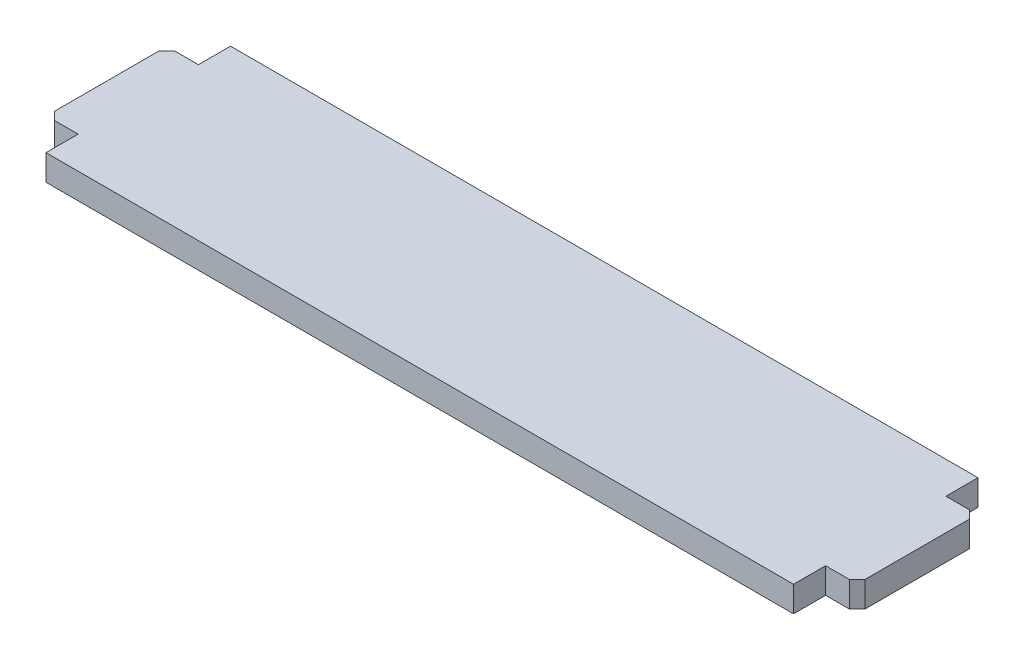
ISO-10303-21;
HEADER;
FILE_DESCRIPTION(('STEP AP214'),'2;1');
FILE_NAME('part.step','',(''),(''),'','','');
FILE_SCHEMA(('AUTOMOTIVE_DESIGN { 1 0 10303 214 1 1 1 1 }'));
ENDSEC;
DATA;
#1=APPLICATION_CONTEXT('core data for automotive mechanical design processes');
#2=APPLICATION_PROTOCOL_DEFINITION('international standard','automotive_design',2000,#1);
#3=PRODUCT_CONTEXT('',#1,'mechanical');
#4=PRODUCT('Part','Part','',(#3));
#5=PRODUCT_RELATED_PRODUCT_CATEGORY('part','',(#4));
#6=PRODUCT_DEFINITION_FORMATION('','',#4);
#7=PRODUCT_DEFINITION_CONTEXT('part definition',#1,'design');
#8=PRODUCT_DEFINITION('design','',#6,#7);
#9=PRODUCT_DEFINITION_SHAPE('','',#8);
#10=(LENGTH_UNIT() NAMED_UNIT(*) SI_UNIT(.MILLI.,.METRE.));
#11=(NAMED_UNIT(*) PLANE_ANGLE_UNIT() SI_UNIT($,.RADIAN.));
#12=(NAMED_UNIT(*) SI_UNIT($,.STERADIAN.) SOLID_ANGLE_UNIT());
#13=UNCERTAINTY_MEASURE_WITH_UNIT(LENGTH_MEASURE(1.E-05),#10,'distance_accuracy_value','');
#14=(GEOMETRIC_REPRESENTATION_CONTEXT(3) GLOBAL_UNCERTAINTY_ASSIGNED_CONTEXT((#13)) GLOBAL_UNIT_ASSIGNED_CONTEXT((#10,
#11,#12)) REPRESENTATION_CONTEXT('',''));
#15=CARTESIAN_POINT('',(0.,0.,0.));
#16=DIRECTION('',(0.,0.,1.));
#17=DIRECTION('',(1.,0.,0.));
#18=AXIS2_PLACEMENT_3D('',#15,#16,#17);
#19=CARTESIAN_POINT('',(-262.716,4.064,106.68));
#20=DIRECTION('',(-1.,0.,0.));
#21=DIRECTION('',(0.,0.,1.));
#22=AXIS2_PLACEMENT_3D('',#19,#20,#21);
#23=PLANE('',#22);
#24=DIRECTION('',(0.,0.,-1.));
#25=VECTOR('',#24,1.);
#26=CARTESIAN_POINT('',(-262.716,0.,106.68));
#27=LINE('',#26,#25);
#28=CARTESIAN_POINT('',(-262.716,0.,111.76));
#29=VERTEX_POINT('',#28);
#30=CARTESIAN_POINT('',(-262.716,0.,106.68));
#31=VERTEX_POINT('',#30);
#32=EDGE_CURVE('E171',#29,#31,#27,.T.);
#33=ORIENTED_EDGE('',*,*,#32,.T.);
#34=DIRECTION('',(0.,-1.,0.));
#35=VECTOR('',#34,1.);
#36=CARTESIAN_POINT('',(-262.716,4.064,106.68));
#37=LINE('',#36,#35);
#38=CARTESIAN_POINT('',(-262.716,4.064,106.68));
#39=VERTEX_POINT('',#38);
#40=EDGE_CURVE('E153',#39,#31,#37,.T.);
#41=ORIENTED_EDGE('',*,*,#40,.F.);
#42=DIRECTION('',(0.,0.,-1.));
#43=VECTOR('',#42,1.);
#44=CARTESIAN_POINT('',(-262.716,4.064,106.68));
#45=LINE('',#44,#43);
#46=CARTESIAN_POINT('',(-262.716,4.064,111.76));
#47=VERTEX_POINT('',#46);
#48=EDGE_CURVE('E159',#47,#39,#45,.T.);
#49=ORIENTED_EDGE('',*,*,#48,.F.);
#50=DIRECTION('',(0.,-1.,0.));
#51=VECTOR('',#50,1.);
#52=CARTESIAN_POINT('',(-262.716,4.064,111.76));
#53=LINE('',#52,#51);
#54=EDGE_CURVE('E232',#47,#29,#53,.T.);
#55=ORIENTED_EDGE('',*,*,#54,.T.);
#56=EDGE_LOOP('',(#33,#41,#49,#55));
#57=FACE_BOUND('',#56,.T.);
#58=ADVANCED_FACE('F35',(#57),#23,.F.);
#59=CARTESIAN_POINT('',(-257.716,4.064,106.68));
#60=DIRECTION('',(0.,0.,-1.));
#61=DIRECTION('',(-1.,0.,0.));
#62=AXIS2_PLACEMENT_3D('',#59,#60,#61);
#63=PLANE('',#62);
#64=DIRECTION('',(1.,0.,0.));
#65=VECTOR('',#64,1.);
#66=CARTESIAN_POINT('',(-257.716,0.,106.68));
#67=LINE('',#66,#65);
#68=CARTESIAN_POINT('',(-258.966,0.,106.68));
#69=VERTEX_POINT('',#68);
#70=EDGE_CURVE('E268',#31,#69,#67,.T.);
#71=ORIENTED_EDGE('',*,*,#70,.T.);
#72=DIRECTION('',(0.,1.,0.));
#73=VECTOR('',#72,1.);
#74=CARTESIAN_POINT('',(-258.966,4.064,106.68));
#75=LINE('',#74,#73);
#76=CARTESIAN_POINT('',(-258.966,4.064,106.68));
#77=VERTEX_POINT('',#76);
#78=EDGE_CURVE('E156',#69,#77,#75,.T.);
#79=ORIENTED_EDGE('',*,*,#78,.T.);
#80=DIRECTION('',(1.,0.,0.));
#81=VECTOR('',#80,1.);
#82=CARTESIAN_POINT('',(-257.716,4.064,106.68));
#83=LINE('',#82,#81);
#84=EDGE_CURVE('E148',#39,#77,#83,.T.);
#85=ORIENTED_EDGE('',*,*,#84,.F.);
#86=ORIENTED_EDGE('',*,*,#40,.T.);
#87=EDGE_LOOP('',(#71,#79,#85,#86));
#88=FACE_BOUND('',#87,.T.);
#89=ADVANCED_FACE('F151',(#88),#63,.F.);
#90=CARTESIAN_POINT('',(-257.716,4.064,87.63));
#91=DIRECTION('',(-1.,0.,0.));
#92=DIRECTION('',(0.,0.,1.));
#93=AXIS2_PLACEMENT_3D('',#90,#91,#92);
#94=PLANE('',#93);
#95=DIRECTION('',(0.,0.,-1.));
#96=VECTOR('',#95,1.);
#97=CARTESIAN_POINT('',(-257.716,4.064,87.63));
#98=LINE('',#97,#96);
#99=CARTESIAN_POINT('',(-257.716,4.064,105.43));
#100=VERTEX_POINT('',#99);
#101=CARTESIAN_POINT('',(-257.716,4.064,88.8800000000001));
#102=VERTEX_POINT('',#101);
#103=EDGE_CURVE('E158',#100,#102,#98,.T.);
#104=ORIENTED_EDGE('',*,*,#103,.F.);
#105=DIRECTION('',(0.,-1.,0.));
#106=VECTOR('',#105,1.);
#107=CARTESIAN_POINT('',(-257.716,4.064,105.43));
#108=LINE('',#107,#106);
#109=CARTESIAN_POINT('',(-257.716,0.,105.43));
#110=VERTEX_POINT('',#109);
#111=EDGE_CURVE('E175',#100,#110,#108,.T.);
#112=ORIENTED_EDGE('',*,*,#111,.T.);
#113=DIRECTION('',(0.,0.,-1.));
#114=VECTOR('',#113,1.);
#115=CARTESIAN_POINT('',(-257.716,0.,87.63));
#116=LINE('',#115,#114);
#117=CARTESIAN_POINT('',(-257.716,0.,88.8800000000001));
#118=VERTEX_POINT('',#117);
#119=EDGE_CURVE('E265',#110,#118,#116,.T.);
#120=ORIENTED_EDGE('',*,*,#119,.T.);
#121=DIRECTION('',(0.,1.,0.));
#122=VECTOR('',#121,1.);
#123=CARTESIAN_POINT('',(-257.716,4.064,88.8800000000001));
#124=LINE('',#123,#122);
#125=EDGE_CURVE('E172',#118,#102,#124,.T.);
#126=ORIENTED_EDGE('',*,*,#125,.T.);
#127=EDGE_LOOP('',(#104,#112,#120,#126));
#128=FACE_BOUND('',#127,.T.);
#129=ADVANCED_FACE('F300',(#128),#94,.F.);
#130=CARTESIAN_POINT('',(-262.716,4.064,87.63));
#131=DIRECTION('',(0.,0.,1.));
#132=DIRECTION('',(1.,0.,0.));
#133=AXIS2_PLACEMENT_3D('',#130,#131,#132);
#134=PLANE('',#133);
#135=DIRECTION('',(-1.,0.,0.));
#136=VECTOR('',#135,1.);
#137=CARTESIAN_POINT('',(-262.716,4.064,87.63));
#138=LINE('',#137,#136);
#139=CARTESIAN_POINT('',(-258.966,4.064,87.63));
#140=VERTEX_POINT('',#139);
#141=CARTESIAN_POINT('',(-262.716,4.064,87.63));
#142=VERTEX_POINT('',#141);
#143=EDGE_CURVE('E285',#140,#142,#138,.T.);
#144=ORIENTED_EDGE('',*,*,#143,.F.);
#145=DIRECTION('',(0.,-1.,0.));
#146=VECTOR('',#145,1.);
#147=CARTESIAN_POINT('',(-258.966,4.064,87.63));
#148=LINE('',#147,#146);
#149=CARTESIAN_POINT('',(-258.966,0.,87.63));
#150=VERTEX_POINT('',#149);
#151=EDGE_CURVE('E200',#140,#150,#148,.T.);
#152=ORIENTED_EDGE('',*,*,#151,.T.);
#153=DIRECTION('',(-1.,0.,0.));
#154=VECTOR('',#153,1.);
#155=CARTESIAN_POINT('',(-262.716,0.,87.63));
#156=LINE('',#155,#154);
#157=CARTESIAN_POINT('',(-262.716,0.,87.63));
#158=VERTEX_POINT('',#157);
#159=EDGE_CURVE('E261',#150,#158,#156,.T.);
#160=ORIENTED_EDGE('',*,*,#159,.T.);
#161=DIRECTION('',(0.,-1.,0.));
#162=VECTOR('',#161,1.);
#163=CARTESIAN_POINT('',(-262.716,4.064,87.63));
#164=LINE('',#163,#162);
#165=EDGE_CURVE('E173',#142,#158,#164,.T.);
#166=ORIENTED_EDGE('',*,*,#165,.F.);
#167=EDGE_LOOP('',(#144,#152,#160,#166));
#168=FACE_BOUND('',#167,.T.);
#169=ADVANCED_FACE('F298',(#168),#134,.F.);
#170=CARTESIAN_POINT('',(-262.716,4.064,82.5500000000001));
#171=DIRECTION('',(-1.,0.,0.));
#172=DIRECTION('',(0.,0.,1.));
#173=AXIS2_PLACEMENT_3D('',#170,#171,#172);
#174=PLANE('',#173);
#175=DIRECTION('',(0.,0.,-1.));
#176=VECTOR('',#175,1.);
#177=CARTESIAN_POINT('',(-262.716,0.,82.5500000000001));
#178=LINE('',#177,#176);
#179=CARTESIAN_POINT('',(-262.716,0.,82.5500000000001));
#180=VERTEX_POINT('',#179);
#181=EDGE_CURVE('E259',#158,#180,#178,.T.);
#182=ORIENTED_EDGE('',*,*,#181,.T.);
#183=DIRECTION('',(0.,-1.,0.));
#184=VECTOR('',#183,1.);
#185=CARTESIAN_POINT('',(-262.716,4.064,82.5500000000001));
#186=LINE('',#185,#184);
#187=CARTESIAN_POINT('',(-262.716,4.064,82.5500000000001));
#188=VERTEX_POINT('',#187);
#189=EDGE_CURVE('E178',#188,#180,#186,.T.);
#190=ORIENTED_EDGE('',*,*,#189,.F.);
#191=DIRECTION('',(0.,0.,-1.));
#192=VECTOR('',#191,1.);
#193=CARTESIAN_POINT('',(-262.716,4.064,82.5500000000001));
#194=LINE('',#193,#192);
#195=EDGE_CURVE('E283',#142,#188,#194,.T.);
#196=ORIENTED_EDGE('',*,*,#195,.F.);
#197=ORIENTED_EDGE('',*,*,#165,.T.);
#198=EDGE_LOOP('',(#182,#190,#196,#197));
#199=FACE_BOUND('',#198,.T.);
#200=ADVANCED_FACE('F359',(#199),#174,.F.);
#201=CARTESIAN_POINT('',(-381.08,4.064,82.5500000000001));
#202=DIRECTION('',(0.,0.,1.));
#203=DIRECTION('',(1.,0.,0.));
#204=AXIS2_PLACEMENT_3D('',#201,#202,#203);
#205=PLANE('',#204);
#206=DIRECTION('',(-1.,0.,0.));
#207=VECTOR('',#206,1.);
#208=CARTESIAN_POINT('',(-381.08,0.,82.5500000000001));
#209=LINE('',#208,#207);
#210=CARTESIAN_POINT('',(-381.08,0.,82.5500000000001));
#211=VERTEX_POINT('',#210);
#212=EDGE_CURVE('E252',#180,#211,#209,.T.);
#213=ORIENTED_EDGE('',*,*,#212,.T.);
#214=DIRECTION('',(0.,-1.,0.));
#215=VECTOR('',#214,1.);
#216=CARTESIAN_POINT('',(-381.08,4.064,82.5500000000001));
#217=LINE('',#216,#215);
#218=CARTESIAN_POINT('',(-381.08,4.064,82.5500000000001));
#219=VERTEX_POINT('',#218);
#220=EDGE_CURVE('E243',#219,#211,#217,.T.);
#221=ORIENTED_EDGE('',*,*,#220,.F.);
#222=DIRECTION('',(-1.,0.,0.));
#223=VECTOR('',#222,1.);
#224=CARTESIAN_POINT('',(-381.08,4.064,82.5500000000001));
#225=LINE('',#224,#223);
#226=EDGE_CURVE('E253',#188,#219,#225,.T.);
#227=ORIENTED_EDGE('',*,*,#226,.F.);
#228=ORIENTED_EDGE('',*,*,#189,.T.);
#229=EDGE_LOOP('',(#213,#221,#227,#228));
#230=FACE_BOUND('',#229,.T.);
#231=ADVANCED_FACE('F250',(#230),#205,.F.);
#232=CARTESIAN_POINT('',(-381.08,4.064,82.5500000000001));
#233=DIRECTION('',(1.,0.,0.));
#234=DIRECTION('',(0.,0.,-1.));
#235=AXIS2_PLACEMENT_3D('',#232,#233,#234);
#236=PLANE('',#235);
#237=DIRECTION('',(0.,0.,1.));
#238=VECTOR('',#237,1.);
#239=CARTESIAN_POINT('',(-381.08,0.,82.5500000000001));
#240=LINE('',#239,#238);
#241=CARTESIAN_POINT('',(-381.08,0.,87.63));
#242=VERTEX_POINT('',#241);
#243=EDGE_CURVE('E226',#211,#242,#240,.T.);
#244=ORIENTED_EDGE('',*,*,#243,.T.);
#245=DIRECTION('',(0.,-1.,0.));
#246=VECTOR('',#245,1.);
#247=CARTESIAN_POINT('',(-381.08,4.064,87.63));
#248=LINE('',#247,#246);
#249=CARTESIAN_POINT('',(-381.08,4.064,87.63));
#250=VERTEX_POINT('',#249);
#251=EDGE_CURVE('E240',#250,#242,#248,.T.);
#252=ORIENTED_EDGE('',*,*,#251,.F.);
#253=DIRECTION('',(0.,0.,1.));
#254=VECTOR('',#253,1.);
#255=CARTESIAN_POINT('',(-381.08,4.064,82.5500000000001));
#256=LINE('',#255,#254);
#257=EDGE_CURVE('E280',#219,#250,#256,.T.);
#258=ORIENTED_EDGE('',*,*,#257,.F.);
#259=ORIENTED_EDGE('',*,*,#220,.T.);
#260=EDGE_LOOP('',(#244,#252,#258,#259));
#261=FACE_BOUND('',#260,.T.);
#262=ADVANCED_FACE('F352',(#261),#236,.F.);
#263=CARTESIAN_POINT('',(-381.08,4.064,87.63));
#264=DIRECTION('',(0.,0.,1.));
#265=DIRECTION('',(1.,0.,0.));
#266=AXIS2_PLACEMENT_3D('',#263,#264,#265);
#267=PLANE('',#266);
#268=DIRECTION('',(-1.,0.,0.));
#269=VECTOR('',#268,1.);
#270=CARTESIAN_POINT('',(-381.08,0.,87.63));
#271=LINE('',#270,#269);
#272=CARTESIAN_POINT('',(-384.83,0.,87.63));
#273=VERTEX_POINT('',#272);
#274=EDGE_CURVE('E222',#242,#273,#271,.T.);
#275=ORIENTED_EDGE('',*,*,#274,.T.);
#276=DIRECTION('',(0.,1.,0.));
#277=VECTOR('',#276,1.);
#278=CARTESIAN_POINT('',(-384.83,4.064,87.63));
#279=LINE('',#278,#277);
#280=CARTESIAN_POINT('',(-384.83,4.064,87.63));
#281=VERTEX_POINT('',#280);
#282=EDGE_CURVE('E11',#273,#281,#279,.T.);
#283=ORIENTED_EDGE('',*,*,#282,.T.);
#284=DIRECTION('',(-1.,0.,0.));
#285=VECTOR('',#284,1.);
#286=CARTESIAN_POINT('',(-381.08,4.064,87.63));
#287=LINE('',#286,#285);
#288=EDGE_CURVE('E277',#250,#281,#287,.T.);
#289=ORIENTED_EDGE('',*,*,#288,.F.);
#290=ORIENTED_EDGE('',*,*,#251,.T.);
#291=EDGE_LOOP('',(#275,#283,#289,#290));
#292=FACE_BOUND('',#291,.T.);
#293=ADVANCED_FACE('F349',(#292),#267,.F.);
#294=CARTESIAN_POINT('',(-386.08,4.064,87.63));
#295=DIRECTION('',(1.,0.,0.));
#296=DIRECTION('',(0.,0.,-1.));
#297=AXIS2_PLACEMENT_3D('',#294,#295,#296);
#298=PLANE('',#297);
#299=DIRECTION('',(0.,0.,1.));
#300=VECTOR('',#299,1.);
#301=CARTESIAN_POINT('',(-386.08,0.,87.63));
#302=LINE('',#301,#300);
#303=CARTESIAN_POINT('',(-386.08,0.,88.88));
#304=VERTEX_POINT('',#303);
#305=CARTESIAN_POINT('',(-386.08,0.,105.43));
#306=VERTEX_POINT('',#305);
#307=EDGE_CURVE('E211',#304,#306,#302,.T.);
#308=ORIENTED_EDGE('',*,*,#307,.T.);
#309=DIRECTION('',(0.,1.,0.));
#310=VECTOR('',#309,1.);
#311=CARTESIAN_POINT('',(-386.08,4.064,105.43));
#312=LINE('',#311,#310);
#313=CARTESIAN_POINT('',(-386.08,4.064,105.43));
#314=VERTEX_POINT('',#313);
#315=EDGE_CURVE('E43',#306,#314,#312,.T.);
#316=ORIENTED_EDGE('',*,*,#315,.T.);
#317=DIRECTION('',(0.,0.,1.));
#318=VECTOR('',#317,1.);
#319=CARTESIAN_POINT('',(-386.08,4.064,87.63));
#320=LINE('',#319,#318);
#321=CARTESIAN_POINT('',(-386.08,4.064,88.88));
#322=VERTEX_POINT('',#321);
#323=EDGE_CURVE('E212',#322,#314,#320,.T.);
#324=ORIENTED_EDGE('',*,*,#323,.F.);
#325=DIRECTION('',(0.,-1.,0.));
#326=VECTOR('',#325,1.);
#327=CARTESIAN_POINT('',(-386.08,4.064,88.88));
#328=LINE('',#327,#326);
#329=EDGE_CURVE('E206',#322,#304,#328,.T.);
#330=ORIENTED_EDGE('',*,*,#329,.T.);
#331=EDGE_LOOP('',(#308,#316,#324,#330));
#332=FACE_BOUND('',#331,.T.);
#333=ADVANCED_FACE('F210',(#332),#298,.F.);
#334=CARTESIAN_POINT('',(-386.08,4.064,106.68));
#335=DIRECTION('',(0.,0.,-1.));
#336=DIRECTION('',(-1.,0.,0.));
#337=AXIS2_PLACEMENT_3D('',#334,#335,#336);
#338=PLANE('',#337);
#339=DIRECTION('',(1.,0.,0.));
#340=VECTOR('',#339,1.);
#341=CARTESIAN_POINT('',(-386.08,4.064,106.68));
#342=LINE('',#341,#340);
#343=CARTESIAN_POINT('',(-384.83,4.064,106.68));
#344=VERTEX_POINT('',#343);
#345=CARTESIAN_POINT('',(-381.08,4.064,106.68));
#346=VERTEX_POINT('',#345);
#347=EDGE_CURVE('E274',#344,#346,#342,.T.);
#348=ORIENTED_EDGE('',*,*,#347,.F.);
#349=DIRECTION('',(0.,-1.,0.));
#350=VECTOR('',#349,1.);
#351=CARTESIAN_POINT('',(-384.83,4.064,106.68));
#352=LINE('',#351,#350);
#353=CARTESIAN_POINT('',(-384.83,0.,106.68));
#354=VERTEX_POINT('',#353);
#355=EDGE_CURVE('E203',#344,#354,#352,.T.);
#356=ORIENTED_EDGE('',*,*,#355,.T.);
#357=DIRECTION('',(1.,0.,0.));
#358=VECTOR('',#357,1.);
#359=CARTESIAN_POINT('',(-386.08,0.,106.68));
#360=LINE('',#359,#358);
#361=CARTESIAN_POINT('',(-381.08,0.,106.68));
#362=VERTEX_POINT('',#361);
#363=EDGE_CURVE('E221',#354,#362,#360,.T.);
#364=ORIENTED_EDGE('',*,*,#363,.T.);
#365=DIRECTION('',(0.,-1.,0.));
#366=VECTOR('',#365,1.);
#367=CARTESIAN_POINT('',(-381.08,4.064,106.68));
#368=LINE('',#367,#366);
#369=EDGE_CURVE('E237',#346,#362,#368,.T.);
#370=ORIENTED_EDGE('',*,*,#369,.F.);
#371=EDGE_LOOP('',(#348,#356,#364,#370));
#372=FACE_BOUND('',#371,.T.);
#373=ADVANCED_FACE('F313',(#372),#338,.F.);
#374=CARTESIAN_POINT('',(-381.08,4.064,106.68));
#375=DIRECTION('',(1.,0.,0.));
#376=DIRECTION('',(0.,0.,-1.));
#377=AXIS2_PLACEMENT_3D('',#374,#375,#376);
#378=PLANE('',#377);
#379=DIRECTION('',(0.,0.,1.));
#380=VECTOR('',#379,1.);
#381=CARTESIAN_POINT('',(-381.08,0.,106.68));
#382=LINE('',#381,#380);
#383=CARTESIAN_POINT('',(-381.08,0.,111.76));
#384=VERTEX_POINT('',#383);
#385=EDGE_CURVE('E224',#362,#384,#382,.T.);
#386=ORIENTED_EDGE('',*,*,#385,.T.);
#387=DIRECTION('',(0.,-1.,0.));
#388=VECTOR('',#387,1.);
#389=CARTESIAN_POINT('',(-381.08,4.064,111.76));
#390=LINE('',#389,#388);
#391=CARTESIAN_POINT('',(-381.08,4.064,111.76));
#392=VERTEX_POINT('',#391);
#393=EDGE_CURVE('E234',#392,#384,#390,.T.);
#394=ORIENTED_EDGE('',*,*,#393,.F.);
#395=DIRECTION('',(0.,0.,1.));
#396=VECTOR('',#395,1.);
#397=CARTESIAN_POINT('',(-381.08,4.064,106.68));
#398=LINE('',#397,#396);
#399=EDGE_CURVE('E272',#346,#392,#398,.T.);
#400=ORIENTED_EDGE('',*,*,#399,.F.);
#401=ORIENTED_EDGE('',*,*,#369,.T.);
#402=EDGE_LOOP('',(#386,#394,#400,#401));
#403=FACE_BOUND('',#402,.T.);
#404=ADVANCED_FACE('F310',(#403),#378,.F.);
#405=CARTESIAN_POINT('',(-381.08,4.064,111.76));
#406=DIRECTION('',(0.,0.,-1.));
#407=DIRECTION('',(-1.,0.,0.));
#408=AXIS2_PLACEMENT_3D('',#405,#406,#407);
#409=PLANE('',#408);
#410=DIRECTION('',(1.,0.,0.));
#411=VECTOR('',#410,1.);
#412=CARTESIAN_POINT('',(-381.08,0.,111.76));
#413=LINE('',#412,#411);
#414=EDGE_CURVE('E168',#384,#29,#413,.T.);
#415=ORIENTED_EDGE('',*,*,#414,.T.);
#416=ORIENTED_EDGE('',*,*,#54,.F.);
#417=DIRECTION('',(1.,0.,0.));
#418=VECTOR('',#417,1.);
#419=CARTESIAN_POINT('',(-381.08,4.064,111.76));
#420=LINE('',#419,#418);
#421=EDGE_CURVE('E164',#392,#47,#420,.T.);
#422=ORIENTED_EDGE('',*,*,#421,.F.);
#423=ORIENTED_EDGE('',*,*,#393,.T.);
#424=EDGE_LOOP('',(#415,#416,#422,#423));
#425=FACE_BOUND('',#424,.T.);
#426=ADVANCED_FACE('F306',(#425),#409,.F.);
#427=CARTESIAN_POINT('',(0.,4.064,0.));
#428=DIRECTION('',(0.,1.,0.));
#429=DIRECTION('',(0.,0.,1.));
#430=AXIS2_PLACEMENT_3D('',#427,#428,#429);
#431=PLANE('',#430);
#432=ORIENTED_EDGE('',*,*,#84,.T.);
#433=DIRECTION('',(-0.70710678118654,0.,0.707106781186555));
#434=VECTOR('',#433,1.);
#435=CARTESIAN_POINT('',(-76.1430000000028,4.064,-76.1430000000011));
#436=LINE('',#435,#434);
#437=EDGE_CURVE('E198',#77,#100,#436,.F.);
#438=ORIENTED_EDGE('',*,*,#437,.T.);
#439=ORIENTED_EDGE('',*,*,#103,.T.);
#440=DIRECTION('',(0.707106781186548,0.,0.707106781186548));
#441=VECTOR('',#440,1.);
#442=CARTESIAN_POINT('',(-173.298,4.064,173.298));
#443=LINE('',#442,#441);
#444=EDGE_CURVE('E196',#102,#140,#443,.F.);
#445=ORIENTED_EDGE('',*,*,#444,.T.);
#446=ORIENTED_EDGE('',*,*,#143,.T.);
#447=ORIENTED_EDGE('',*,*,#195,.T.);
#448=ORIENTED_EDGE('',*,*,#226,.T.);
#449=ORIENTED_EDGE('',*,*,#257,.T.);
#450=ORIENTED_EDGE('',*,*,#288,.T.);
#451=DIRECTION('',(0.70710678118654,0.,-0.707106781186555));
#452=VECTOR('',#451,1.);
#453=CARTESIAN_POINT('',(-148.600000000004,4.064,-148.600000000001));
#454=LINE('',#453,#452);
#455=EDGE_CURVE('E193',#281,#322,#454,.F.);
#456=ORIENTED_EDGE('',*,*,#455,.T.);
#457=ORIENTED_EDGE('',*,*,#323,.T.);
#458=DIRECTION('',(-0.707106781186548,0.,-0.707106781186548));
#459=VECTOR('',#458,1.);
#460=CARTESIAN_POINT('',(-245.755,4.064,245.755));
#461=LINE('',#460,#459);
#462=EDGE_CURVE('E50',#314,#344,#461,.F.);
#463=ORIENTED_EDGE('',*,*,#462,.T.);
#464=ORIENTED_EDGE('',*,*,#347,.T.);
#465=ORIENTED_EDGE('',*,*,#399,.T.);
#466=ORIENTED_EDGE('',*,*,#421,.T.);
#467=ORIENTED_EDGE('',*,*,#48,.T.);
#468=EDGE_LOOP('',(#432,#438,#439,#445,#446,#447,#448,#449,#450,#456,#457,#463,#464,#465,#466,#467));
#469=FACE_BOUND('',#468,.T.);
#470=ADVANCED_FACE('F162',(#469),#431,.T.);
#471=CARTESIAN_POINT('',(0.,0.,0.));
#472=DIRECTION('',(0.,1.,0.));
#473=DIRECTION('',(0.,0.,1.));
#474=AXIS2_PLACEMENT_3D('',#471,#472,#473);
#475=PLANE('',#474);
#476=ORIENTED_EDGE('',*,*,#119,.F.);
#477=DIRECTION('',(0.70710678118654,0.,-0.707106781186555));
#478=VECTOR('',#477,1.);
#479=CARTESIAN_POINT('',(-257.716,0.,105.43));
#480=LINE('',#479,#478);
#481=EDGE_CURVE('E190',#110,#69,#480,.F.);
#482=ORIENTED_EDGE('',*,*,#481,.T.);
#483=ORIENTED_EDGE('',*,*,#70,.F.);
#484=ORIENTED_EDGE('',*,*,#32,.F.);
#485=ORIENTED_EDGE('',*,*,#414,.F.);
#486=ORIENTED_EDGE('',*,*,#385,.F.);
#487=ORIENTED_EDGE('',*,*,#363,.F.);
#488=DIRECTION('',(0.707106781186548,0.,0.707106781186548));
#489=VECTOR('',#488,1.);
#490=CARTESIAN_POINT('',(-384.83,0.,106.68));
#491=LINE('',#490,#489);
#492=EDGE_CURVE('E186',#354,#306,#491,.F.);
#493=ORIENTED_EDGE('',*,*,#492,.T.);
#494=ORIENTED_EDGE('',*,*,#307,.F.);
#495=DIRECTION('',(-0.70710678118654,0.,0.707106781186555));
#496=VECTOR('',#495,1.);
#497=CARTESIAN_POINT('',(-386.08,0.,88.88));
#498=LINE('',#497,#496);
#499=EDGE_CURVE('E184',#304,#273,#498,.F.);
#500=ORIENTED_EDGE('',*,*,#499,.T.);
#501=ORIENTED_EDGE('',*,*,#274,.F.);
#502=ORIENTED_EDGE('',*,*,#243,.F.);
#503=ORIENTED_EDGE('',*,*,#212,.F.);
#504=ORIENTED_EDGE('',*,*,#181,.F.);
#505=ORIENTED_EDGE('',*,*,#159,.F.);
#506=DIRECTION('',(-0.707106781186548,0.,-0.707106781186548));
#507=VECTOR('',#506,1.);
#508=CARTESIAN_POINT('',(-258.966,0.,87.63));
#509=LINE('',#508,#507);
#510=EDGE_CURVE('E188',#150,#118,#509,.F.);
#511=ORIENTED_EDGE('',*,*,#510,.T.);
#512=EDGE_LOOP('',(#476,#482,#483,#484,#485,#486,#487,#493,#494,#500,#501,#502,#503,#504,#505,#511));
#513=FACE_BOUND('',#512,.T.);
#514=ADVANCED_FACE('F217',(#513),#475,.F.);
#515=CARTESIAN_POINT('',(-257.716,4.064,105.43));
#516=DIRECTION('',(-0.707106781186555,0.,-0.70710678118654));
#517=DIRECTION('',(0.,-1.,0.));
#518=AXIS2_PLACEMENT_3D('',#515,#516,#517);
#519=PLANE('',#518);
#520=ORIENTED_EDGE('',*,*,#437,.F.);
#521=ORIENTED_EDGE('',*,*,#78,.F.);
#522=ORIENTED_EDGE('',*,*,#481,.F.);
#523=ORIENTED_EDGE('',*,*,#111,.F.);
#524=EDGE_LOOP('',(#520,#521,#522,#523));
#525=FACE_BOUND('',#524,.T.);
#526=ADVANCED_FACE('F302',(#525),#519,.F.);
#527=CARTESIAN_POINT('',(-258.966,4.064,87.63));
#528=DIRECTION('',(-0.707106781186548,0.,0.707106781186548));
#529=DIRECTION('',(0.,-1.,0.));
#530=AXIS2_PLACEMENT_3D('',#527,#528,#529);
#531=PLANE('',#530);
#532=ORIENTED_EDGE('',*,*,#444,.F.);
#533=ORIENTED_EDGE('',*,*,#125,.F.);
#534=ORIENTED_EDGE('',*,*,#510,.F.);
#535=ORIENTED_EDGE('',*,*,#151,.F.);
#536=EDGE_LOOP('',(#532,#533,#534,#535));
#537=FACE_BOUND('',#536,.T.);
#538=ADVANCED_FACE('F296',(#537),#531,.F.);
#539=CARTESIAN_POINT('',(-384.83,4.064,106.68));
#540=DIRECTION('',(0.707106781186548,0.,-0.707106781186548));
#541=DIRECTION('',(0.,-1.,0.));
#542=AXIS2_PLACEMENT_3D('',#539,#540,#541);
#543=PLANE('',#542);
#544=ORIENTED_EDGE('',*,*,#462,.F.);
#545=ORIENTED_EDGE('',*,*,#315,.F.);
#546=ORIENTED_EDGE('',*,*,#492,.F.);
#547=ORIENTED_EDGE('',*,*,#355,.F.);
#548=EDGE_LOOP('',(#544,#545,#546,#547));
#549=FACE_BOUND('',#548,.T.);
#550=ADVANCED_FACE('F316',(#549),#543,.F.);
#551=CARTESIAN_POINT('',(-386.08,4.064,88.88));
#552=DIRECTION('',(0.707106781186555,0.,0.70710678118654));
#553=DIRECTION('',(0.,-1.,0.));
#554=AXIS2_PLACEMENT_3D('',#551,#552,#553);
#555=PLANE('',#554);
#556=ORIENTED_EDGE('',*,*,#455,.F.);
#557=ORIENTED_EDGE('',*,*,#282,.F.);
#558=ORIENTED_EDGE('',*,*,#499,.F.);
#559=ORIENTED_EDGE('',*,*,#329,.F.);
#560=EDGE_LOOP('',(#556,#557,#558,#559));
#561=FACE_BOUND('',#560,.T.);
#562=ADVANCED_FACE('F37',(#561),#555,.F.);
#563=CLOSED_SHELL('',(#58,#89,#129,#169,#200,#231,#262,#293,#333,#373,#404,#426,#470,#514,#526,
#538,#550,#562));
#564=MANIFOLD_SOLID_BREP('B2',#563);
#565=ADVANCED_BREP_SHAPE_REPRESENTATION('',(#18,#564),#14);
#566=SHAPE_DEFINITION_REPRESENTATION(#9,#565);
ENDSEC;
END-ISO-10303-21;
